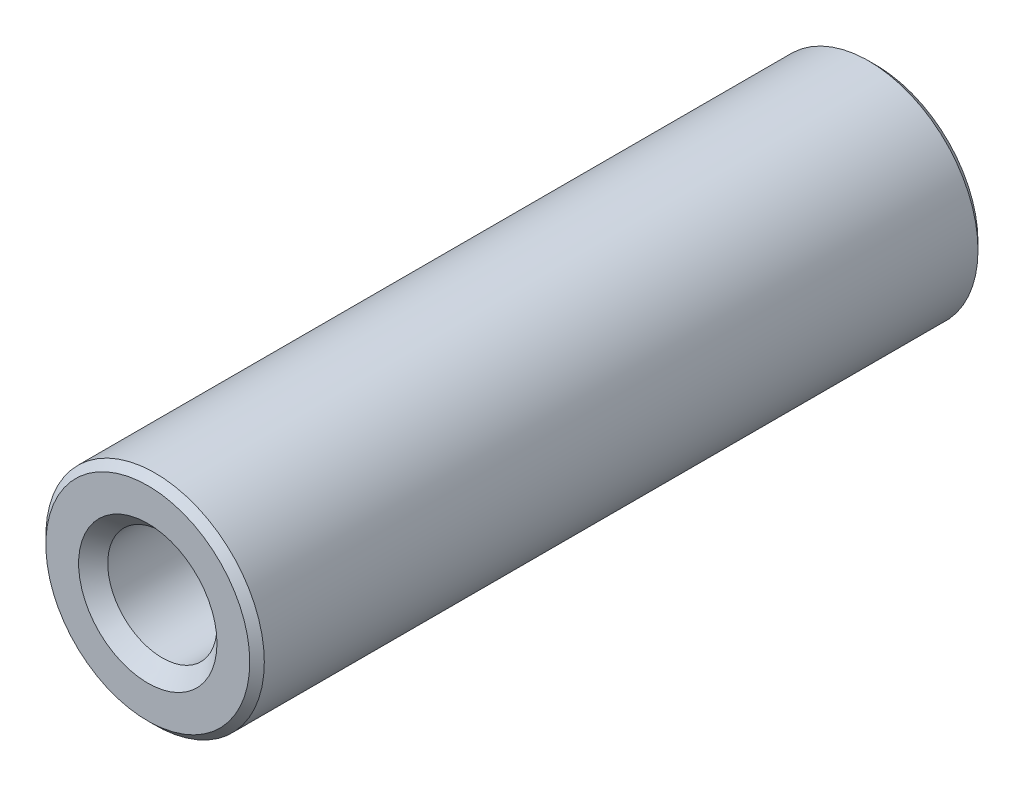
ISO-10303-21;
HEADER;
FILE_DESCRIPTION(('STEP AP214'),'2;1');
FILE_NAME('part.step','',(''),(''),'','','');
FILE_SCHEMA(('AUTOMOTIVE_DESIGN { 1 0 10303 214 1 1 1 1 }'));
ENDSEC;
DATA;
#1=APPLICATION_CONTEXT('core data for automotive mechanical design processes');
#2=APPLICATION_PROTOCOL_DEFINITION('international standard','automotive_design',2000,#1);
#3=PRODUCT_CONTEXT('',#1,'mechanical');
#4=PRODUCT('Part','Part','',(#3));
#5=PRODUCT_RELATED_PRODUCT_CATEGORY('part','',(#4));
#6=PRODUCT_DEFINITION_FORMATION('','',#4);
#7=PRODUCT_DEFINITION_CONTEXT('part definition',#1,'design');
#8=PRODUCT_DEFINITION('design','',#6,#7);
#9=PRODUCT_DEFINITION_SHAPE('','',#8);
#10=(LENGTH_UNIT() NAMED_UNIT(*) SI_UNIT(.MILLI.,.METRE.));
#11=(NAMED_UNIT(*) PLANE_ANGLE_UNIT() SI_UNIT($,.RADIAN.));
#12=(NAMED_UNIT(*) SI_UNIT($,.STERADIAN.) SOLID_ANGLE_UNIT());
#13=UNCERTAINTY_MEASURE_WITH_UNIT(LENGTH_MEASURE(1.E-05),#10,'distance_accuracy_value','');
#14=(GEOMETRIC_REPRESENTATION_CONTEXT(3) GLOBAL_UNCERTAINTY_ASSIGNED_CONTEXT((#13)) GLOBAL_UNIT_ASSIGNED_CONTEXT((#10,
#11,#12)) REPRESENTATION_CONTEXT('',''));
#15=CARTESIAN_POINT('',(0.,0.,0.));
#16=DIRECTION('',(0.,0.,1.));
#17=DIRECTION('',(1.,0.,0.));
#18=AXIS2_PLACEMENT_3D('',#15,#16,#17);
#19=CARTESIAN_POINT('',(0.,0.,-25.0030516408341));
#20=DIRECTION('',(0.,0.,1.));
#21=DIRECTION('',(1.,0.,0.));
#22=AXIS2_PLACEMENT_3D('',#19,#20,#21);
#23=CYLINDRICAL_SURFACE('',#22,1.5);
#24=CARTESIAN_POINT('',(0.,0.,9.39994072718925));
#25=DIRECTION('',(0.,0.,1.));
#26=DIRECTION('',(1.,0.,0.));
#27=AXIS2_PLACEMENT_3D('',#24,#25,#26);
#28=CIRCLE('',#27,1.5);
#29=CARTESIAN_POINT('',(1.5,0.,9.39994072718925));
#30=VERTEX_POINT('',#29);
#31=EDGE_CURVE('E67',#30,#30,#28,.T.);
#32=ORIENTED_EDGE('',*,*,#31,.T.);
#33=EDGE_LOOP('',(#32));
#34=FACE_BOUND('',#33,.T.);
#35=CARTESIAN_POINT('',(0.,0.,5.39994072718925));
#36=DIRECTION('',(0.,0.,1.));
#37=DIRECTION('',(1.,0.,0.));
#38=AXIS2_PLACEMENT_3D('',#35,#36,#37);
#39=CIRCLE('',#38,1.5);
#40=CARTESIAN_POINT('',(1.5,0.,5.39994072718925));
#41=VERTEX_POINT('',#40);
#42=EDGE_CURVE('E10',#41,#41,#39,.T.);
#43=ORIENTED_EDGE('',*,*,#42,.F.);
#44=EDGE_LOOP('',(#43));
#45=FACE_BOUND('',#44,.T.);
#46=ADVANCED_FACE('F33',(#34,#45),#23,.F.);
#47=CARTESIAN_POINT('',(0.,0.,5.));
#48=DIRECTION('',(0.,0.,-1.));
#49=DIRECTION('',(-1.,0.,0.));
#50=AXIS2_PLACEMENT_3D('',#47,#48,#49);
#51=CONICAL_SURFACE('',#50,1.89992492404044,0.785378406143488);
#52=ORIENTED_EDGE('',*,*,#42,.T.);
#53=EDGE_LOOP('',(#52));
#54=FACE_BOUND('',#53,.T.);
#55=CARTESIAN_POINT('',(0.,0.,5.));
#56=DIRECTION('',(0.,0.,1.));
#57=DIRECTION('',(1.,0.,0.));
#58=AXIS2_PLACEMENT_3D('',#55,#56,#57);
#59=CIRCLE('',#58,1.89992492404044);
#60=CARTESIAN_POINT('',(1.89992492404044,0.,5.));
#61=VERTEX_POINT('',#60);
#62=EDGE_CURVE('E39',#61,#61,#59,.T.);
#63=ORIENTED_EDGE('',*,*,#62,.F.);
#64=EDGE_LOOP('',(#63));
#65=FACE_BOUND('',#64,.T.);
#66=ADVANCED_FACE('F84',(#54,#65),#51,.F.);
#67=CARTESIAN_POINT('',(2.79996108933619,0.,5.));
#68=DIRECTION('',(0.,0.,-1.));
#69=DIRECTION('',(-1.,0.,0.));
#70=AXIS2_PLACEMENT_3D('',#67,#68,#69);
#71=PLANE('',#70);
#72=ORIENTED_EDGE('',*,*,#62,.T.);
#73=EDGE_LOOP('',(#72));
#74=FACE_BOUND('',#73,.T.);
#75=CARTESIAN_POINT('',(0.,0.,5.));
#76=DIRECTION('',(0.,0.,1.));
#77=DIRECTION('',(1.,0.,0.));
#78=AXIS2_PLACEMENT_3D('',#75,#76,#77);
#79=CIRCLE('',#78,2.79996108933619);
#80=CARTESIAN_POINT('',(2.79996108933619,0.,5.));
#81=VERTEX_POINT('',#80);
#82=EDGE_CURVE('E43',#81,#81,#79,.T.);
#83=ORIENTED_EDGE('',*,*,#82,.F.);
#84=EDGE_LOOP('',(#83));
#85=FACE_BOUND('',#84,.T.);
#86=ADVANCED_FACE('F88',(#74,#85),#71,.T.);
#87=CARTESIAN_POINT('',(0.,0.,5.20004175594284));
#88=DIRECTION('',(0.,0.,1.));
#89=DIRECTION('',(1.,0.,0.));
#90=AXIS2_PLACEMENT_3D('',#87,#88,#89);
#91=CONICAL_SURFACE('',#90,2.99999999999999,0.785391051634063);
#92=ORIENTED_EDGE('',*,*,#82,.T.);
#93=EDGE_LOOP('',(#92));
#94=FACE_BOUND('',#93,.T.);
#95=CARTESIAN_POINT('',(0.,0.,5.20004175594284));
#96=DIRECTION('',(0.,0.,1.));
#97=DIRECTION('',(1.,0.,0.));
#98=AXIS2_PLACEMENT_3D('',#95,#96,#97);
#99=CIRCLE('',#98,2.99999999999999);
#100=CARTESIAN_POINT('',(2.99999999999999,0.,5.20004175594284));
#101=VERTEX_POINT('',#100);
#102=EDGE_CURVE('E47',#101,#101,#99,.T.);
#103=ORIENTED_EDGE('',*,*,#102,.F.);
#104=EDGE_LOOP('',(#103));
#105=FACE_BOUND('',#104,.T.);
#106=ADVANCED_FACE('F92',(#94,#105),#91,.T.);
#107=CARTESIAN_POINT('',(0.,0.,-25.0030516408341));
#108=DIRECTION('',(0.,0.,1.));
#109=DIRECTION('',(1.,0.,0.));
#110=AXIS2_PLACEMENT_3D('',#107,#108,#109);
#111=CYLINDRICAL_SURFACE('',#110,2.99999999999999);
#112=ORIENTED_EDGE('',*,*,#102,.T.);
#113=EDGE_LOOP('',(#112));
#114=FACE_BOUND('',#113,.T.);
#115=CARTESIAN_POINT('',(0.,0.,24.7999245050787));
#116=DIRECTION('',(0.,0.,1.));
#117=DIRECTION('',(1.,0.,0.));
#118=AXIS2_PLACEMENT_3D('',#115,#116,#117);
#119=CIRCLE('',#118,2.99999999999999);
#120=CARTESIAN_POINT('',(2.99999999999999,0.,24.7999245050787));
#121=VERTEX_POINT('',#120);
#122=EDGE_CURVE('E52',#121,#121,#119,.T.);
#123=ORIENTED_EDGE('',*,*,#122,.F.);
#124=EDGE_LOOP('',(#123));
#125=FACE_BOUND('',#124,.T.);
#126=ADVANCED_FACE('F98',(#114,#125),#111,.T.);
#127=CARTESIAN_POINT('',(0.,0.,25.));
#128=DIRECTION('',(0.,0.,-1.));
#129=DIRECTION('',(-1.,0.,0.));
#130=AXIS2_PLACEMENT_3D('',#127,#128,#129);
#131=CONICAL_SURFACE('',#130,2.79992953986533,0.785385581022011);
#132=ORIENTED_EDGE('',*,*,#122,.T.);
#133=EDGE_LOOP('',(#132));
#134=FACE_BOUND('',#133,.T.);
#135=CARTESIAN_POINT('',(0.,0.,25.));
#136=DIRECTION('',(0.,0.,1.));
#137=DIRECTION('',(1.,0.,0.));
#138=AXIS2_PLACEMENT_3D('',#135,#136,#137);
#139=CIRCLE('',#138,2.79992953986533);
#140=CARTESIAN_POINT('',(2.79992953986533,0.,25.));
#141=VERTEX_POINT('',#140);
#142=EDGE_CURVE('E55',#141,#141,#139,.T.);
#143=ORIENTED_EDGE('',*,*,#142,.F.);
#144=EDGE_LOOP('',(#143));
#145=FACE_BOUND('',#144,.T.);
#146=ADVANCED_FACE('F102',(#134,#145),#131,.T.);
#147=CARTESIAN_POINT('',(1.89992492404044,0.,25.));
#148=DIRECTION('',(0.,0.,1.));
#149=DIRECTION('',(1.,0.,0.));
#150=AXIS2_PLACEMENT_3D('',#147,#148,#149);
#151=PLANE('',#150);
#152=ORIENTED_EDGE('',*,*,#142,.T.);
#153=EDGE_LOOP('',(#152));
#154=FACE_BOUND('',#153,.T.);
#155=CARTESIAN_POINT('',(0.,0.,25.));
#156=DIRECTION('',(0.,0.,1.));
#157=DIRECTION('',(1.,0.,0.));
#158=AXIS2_PLACEMENT_3D('',#155,#156,#157);
#159=CIRCLE('',#158,1.89992492404044);
#160=CARTESIAN_POINT('',(1.89992492404044,0.,25.));
#161=VERTEX_POINT('',#160);
#162=EDGE_CURVE('E58',#161,#161,#159,.T.);
#163=ORIENTED_EDGE('',*,*,#162,.F.);
#164=EDGE_LOOP('',(#163));
#165=FACE_BOUND('',#164,.T.);
#166=ADVANCED_FACE('F106',(#154,#165),#151,.T.);
#167=CARTESIAN_POINT('',(0.,0.,24.6000592728107));
#168=DIRECTION('',(0.,0.,1.));
#169=DIRECTION('',(1.,0.,0.));
#170=AXIS2_PLACEMENT_3D('',#167,#168,#169);
#171=CONICAL_SURFACE('',#170,1.5,0.785378406143483);
#172=ORIENTED_EDGE('',*,*,#162,.T.);
#173=EDGE_LOOP('',(#172));
#174=FACE_BOUND('',#173,.T.);
#175=CARTESIAN_POINT('',(0.,0.,24.6000592728107));
#176=DIRECTION('',(0.,0.,1.));
#177=DIRECTION('',(1.,0.,0.));
#178=AXIS2_PLACEMENT_3D('',#175,#176,#177);
#179=CIRCLE('',#178,1.5);
#180=CARTESIAN_POINT('',(1.5,0.,24.6000592728107));
#181=VERTEX_POINT('',#180);
#182=EDGE_CURVE('E61',#181,#181,#179,.T.);
#183=ORIENTED_EDGE('',*,*,#182,.F.);
#184=EDGE_LOOP('',(#183));
#185=FACE_BOUND('',#184,.T.);
#186=ADVANCED_FACE('F110',(#174,#185),#171,.F.);
#187=CARTESIAN_POINT('',(0.,0.,-25.0030516408341));
#188=DIRECTION('',(0.,0.,1.));
#189=DIRECTION('',(1.,0.,0.));
#190=AXIS2_PLACEMENT_3D('',#187,#188,#189);
#191=CYLINDRICAL_SURFACE('',#190,1.5);
#192=ORIENTED_EDGE('',*,*,#182,.T.);
#193=EDGE_LOOP('',(#192));
#194=FACE_BOUND('',#193,.T.);
#195=CARTESIAN_POINT('',(0.,0.,20.6000592728107));
#196=DIRECTION('',(0.,0.,1.));
#197=DIRECTION('',(1.,0.,0.));
#198=AXIS2_PLACEMENT_3D('',#195,#196,#197);
#199=CIRCLE('',#198,1.5);
#200=CARTESIAN_POINT('',(1.5,0.,20.6000592728107));
#201=VERTEX_POINT('',#200);
#202=EDGE_CURVE('E64',#201,#201,#199,.T.);
#203=ORIENTED_EDGE('',*,*,#202,.F.);
#204=EDGE_LOOP('',(#203));
#205=FACE_BOUND('',#204,.T.);
#206=ADVANCED_FACE('F80',(#194,#205),#191,.F.);
#207=CARTESIAN_POINT('',(0.,0.,20.6000592728107));
#208=DIRECTION('',(0.,0.,1.));
#209=DIRECTION('',(1.,0.,0.));
#210=AXIS2_PLACEMENT_3D('',#207,#208,#209);
#211=PLANE('',#210);
#212=ORIENTED_EDGE('',*,*,#202,.T.);
#213=EDGE_LOOP('',(#212));
#214=FACE_BOUND('',#213,.T.);
#215=ADVANCED_FACE('F75',(#214),#211,.T.);
#216=CARTESIAN_POINT('',(1.5,0.,9.39994072718925));
#217=DIRECTION('',(0.,0.,-1.));
#218=DIRECTION('',(-1.,0.,0.));
#219=AXIS2_PLACEMENT_3D('',#216,#217,#218);
#220=PLANE('',#219);
#221=ORIENTED_EDGE('',*,*,#31,.F.);
#222=EDGE_LOOP('',(#221));
#223=FACE_BOUND('',#222,.T.);
#224=ADVANCED_FACE('F73',(#223),#220,.T.);
#225=CLOSED_SHELL('',(#46,#66,#86,#106,#126,#146,#166,#186,#206,#215,#224));
#226=MANIFOLD_SOLID_BREP('B2',#225);
#227=ADVANCED_BREP_SHAPE_REPRESENTATION('',(#18,#226),#14);
#228=SHAPE_DEFINITION_REPRESENTATION(#9,#227);
ENDSEC;
END-ISO-10303-21;
